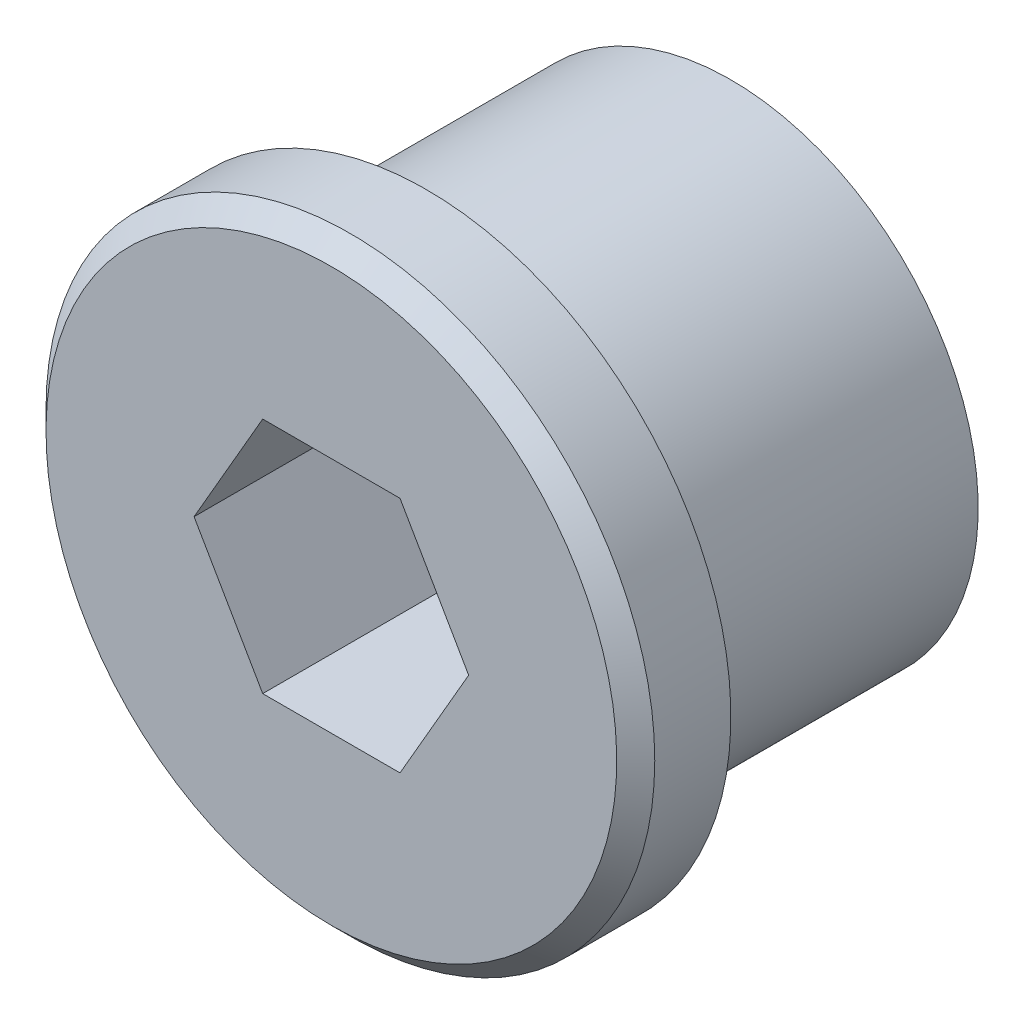
ISO-10303-21;
HEADER;
FILE_DESCRIPTION(('STEP AP214'),'2;1');
FILE_NAME('part.step','',(''),(''),'','','');
FILE_SCHEMA(('AUTOMOTIVE_DESIGN { 1 0 10303 214 1 1 1 1 }'));
ENDSEC;
DATA;
#1=APPLICATION_CONTEXT('core data for automotive mechanical design processes');
#2=APPLICATION_PROTOCOL_DEFINITION('international standard','automotive_design',2000,#1);
#3=PRODUCT_CONTEXT('',#1,'mechanical');
#4=PRODUCT('Part','Part','',(#3));
#5=PRODUCT_RELATED_PRODUCT_CATEGORY('part','',(#4));
#6=PRODUCT_DEFINITION_FORMATION('','',#4);
#7=PRODUCT_DEFINITION_CONTEXT('part definition',#1,'design');
#8=PRODUCT_DEFINITION('design','',#6,#7);
#9=PRODUCT_DEFINITION_SHAPE('','',#8);
#10=(LENGTH_UNIT() NAMED_UNIT(*) SI_UNIT(.MILLI.,.METRE.));
#11=(NAMED_UNIT(*) PLANE_ANGLE_UNIT() SI_UNIT($,.RADIAN.));
#12=(NAMED_UNIT(*) SI_UNIT($,.STERADIAN.) SOLID_ANGLE_UNIT());
#13=UNCERTAINTY_MEASURE_WITH_UNIT(LENGTH_MEASURE(1.E-05),#10,'distance_accuracy_value','');
#14=(GEOMETRIC_REPRESENTATION_CONTEXT(3) GLOBAL_UNCERTAINTY_ASSIGNED_CONTEXT((#13)) GLOBAL_UNIT_ASSIGNED_CONTEXT((#10,
#11,#12)) REPRESENTATION_CONTEXT('',''));
#15=CARTESIAN_POINT('',(0.,0.,0.));
#16=DIRECTION('',(0.,0.,1.));
#17=DIRECTION('',(1.,0.,0.));
#18=AXIS2_PLACEMENT_3D('',#15,#16,#17);
#19=CARTESIAN_POINT('',(0.,0.,-9.6));
#20=DIRECTION('',(0.,0.,1.));
#21=DIRECTION('',(1.,0.,0.));
#22=AXIS2_PLACEMENT_3D('',#19,#20,#21);
#23=PLANE('',#22);
#24=DIRECTION('',(0.500000000006738,0.866025403780548,0.));
#25=VECTOR('',#24,1.);
#26=CARTESIAN_POINT('',(2.886751346,-5.,-9.6));
#27=LINE('',#26,#25);
#28=CARTESIAN_POINT('',(2.886751346,-5.,-9.6));
#29=VERTEX_POINT('',#28);
#30=CARTESIAN_POINT('',(5.773502692,0.,-9.6));
#31=VERTEX_POINT('',#30);
#32=EDGE_CURVE('E179',#29,#31,#27,.T.);
#33=ORIENTED_EDGE('',*,*,#32,.T.);
#34=DIRECTION('',(-0.500000000006738,0.866025403780548,0.));
#35=VECTOR('',#34,1.);
#36=CARTESIAN_POINT('',(5.773502692,0.,-9.6));
#37=LINE('',#36,#35);
#38=CARTESIAN_POINT('',(2.886751346,5.,-9.6));
#39=VERTEX_POINT('',#38);
#40=EDGE_CURVE('E11',#31,#39,#37,.T.);
#41=ORIENTED_EDGE('',*,*,#40,.T.);
#42=DIRECTION('',(-1.,0.,0.));
#43=VECTOR('',#42,1.);
#44=CARTESIAN_POINT('',(2.886751346,5.,-9.6));
#45=LINE('',#44,#43);
#46=CARTESIAN_POINT('',(-2.886751346,5.,-9.6));
#47=VERTEX_POINT('',#46);
#48=EDGE_CURVE('E43',#39,#47,#45,.T.);
#49=ORIENTED_EDGE('',*,*,#48,.T.);
#50=DIRECTION('',(-0.500000000006738,-0.866025403780548,0.));
#51=VECTOR('',#50,1.);
#52=CARTESIAN_POINT('',(-2.886751346,5.,-9.6));
#53=LINE('',#52,#51);
#54=CARTESIAN_POINT('',(-5.773502692,0.,-9.6));
#55=VERTEX_POINT('',#54);
#56=EDGE_CURVE('E197',#47,#55,#53,.T.);
#57=ORIENTED_EDGE('',*,*,#56,.T.);
#58=DIRECTION('',(0.500000000006738,-0.866025403780548,0.));
#59=VECTOR('',#58,1.);
#60=CARTESIAN_POINT('',(-5.773502692,0.,-9.6));
#61=LINE('',#60,#59);
#62=CARTESIAN_POINT('',(-2.886751346,-5.,-9.6));
#63=VERTEX_POINT('',#62);
#64=EDGE_CURVE('E191',#55,#63,#61,.T.);
#65=ORIENTED_EDGE('',*,*,#64,.T.);
#66=DIRECTION('',(1.,0.,0.));
#67=VECTOR('',#66,1.);
#68=CARTESIAN_POINT('',(-2.886751346,-5.,-9.6));
#69=LINE('',#68,#67);
#70=EDGE_CURVE('E185',#63,#29,#69,.T.);
#71=ORIENTED_EDGE('',*,*,#70,.T.);
#72=EDGE_LOOP('',(#33,#41,#49,#57,#65,#71));
#73=FACE_BOUND('',#72,.T.);
#74=ADVANCED_FACE('F17',(#73),#23,.T.);
#75=CARTESIAN_POINT('',(5.773502692,0.,-9.6));
#76=DIRECTION('',(0.866025403838329,0.499999999906659,0.));
#77=DIRECTION('',(0.,0.,-1.));
#78=AXIS2_PLACEMENT_3D('',#75,#76,#77);
#79=PLANE('',#78);
#80=DIRECTION('',(-0.500000000006738,0.866025403780548,0.));
#81=VECTOR('',#80,1.);
#82=CARTESIAN_POINT('',(5.773502692,0.,0.));
#83=LINE('',#82,#81);
#84=CARTESIAN_POINT('',(5.773502692,0.,0.));
#85=VERTEX_POINT('',#84);
#86=CARTESIAN_POINT('',(2.886751346,5.,0.));
#87=VERTEX_POINT('',#86);
#88=EDGE_CURVE('E143',#85,#87,#83,.T.);
#89=ORIENTED_EDGE('',*,*,#88,.T.);
#90=DIRECTION('',(0.,0.,1.));
#91=VECTOR('',#90,1.);
#92=CARTESIAN_POINT('',(2.886751346,5.,-9.6));
#93=LINE('',#92,#91);
#94=EDGE_CURVE('E26',#39,#87,#93,.T.);
#95=ORIENTED_EDGE('',*,*,#94,.F.);
#96=ORIENTED_EDGE('',*,*,#40,.F.);
#97=DIRECTION('',(0.,0.,1.));
#98=VECTOR('',#97,1.);
#99=CARTESIAN_POINT('',(5.773502692,0.,-9.6));
#100=LINE('',#99,#98);
#101=EDGE_CURVE('E147',#31,#85,#100,.T.);
#102=ORIENTED_EDGE('',*,*,#101,.T.);
#103=EDGE_LOOP('',(#89,#95,#96,#102));
#104=FACE_BOUND('',#103,.T.);
#105=ADVANCED_FACE('F19',(#104),#79,.F.);
#106=CARTESIAN_POINT('',(2.886751346,5.,-9.6));
#107=DIRECTION('',(0.,1.,0.));
#108=DIRECTION('',(1.,0.,0.));
#109=AXIS2_PLACEMENT_3D('',#106,#107,#108);
#110=PLANE('',#109);
#111=DIRECTION('',(-1.,0.,0.));
#112=VECTOR('',#111,1.);
#113=CARTESIAN_POINT('',(2.886751346,5.,0.));
#114=LINE('',#113,#112);
#115=CARTESIAN_POINT('',(-2.886751346,5.,0.));
#116=VERTEX_POINT('',#115);
#117=EDGE_CURVE('E148',#87,#116,#114,.T.);
#118=ORIENTED_EDGE('',*,*,#117,.T.);
#119=DIRECTION('',(0.,0.,1.));
#120=VECTOR('',#119,1.);
#121=CARTESIAN_POINT('',(-2.886751346,5.,-9.6));
#122=LINE('',#121,#120);
#123=EDGE_CURVE('E128',#47,#116,#122,.T.);
#124=ORIENTED_EDGE('',*,*,#123,.F.);
#125=ORIENTED_EDGE('',*,*,#48,.F.);
#126=ORIENTED_EDGE('',*,*,#94,.T.);
#127=EDGE_LOOP('',(#118,#124,#125,#126));
#128=FACE_BOUND('',#127,.T.);
#129=ADVANCED_FACE('F204',(#128),#110,.F.);
#130=CARTESIAN_POINT('',(-2.886751346,5.,-9.6));
#131=DIRECTION('',(-0.866025403838329,0.499999999906659,0.));
#132=DIRECTION('',(0.,0.,1.));
#133=AXIS2_PLACEMENT_3D('',#130,#131,#132);
#134=PLANE('',#133);
#135=DIRECTION('',(-0.500000000006738,-0.866025403780548,0.));
#136=VECTOR('',#135,1.);
#137=CARTESIAN_POINT('',(-2.886751346,5.,0.));
#138=LINE('',#137,#136);
#139=CARTESIAN_POINT('',(-5.773502692,0.,0.));
#140=VERTEX_POINT('',#139);
#141=EDGE_CURVE('E167',#116,#140,#138,.T.);
#142=ORIENTED_EDGE('',*,*,#141,.T.);
#143=DIRECTION('',(0.,0.,1.));
#144=VECTOR('',#143,1.);
#145=CARTESIAN_POINT('',(-5.773502692,0.,-9.6));
#146=LINE('',#145,#144);
#147=EDGE_CURVE('E194',#55,#140,#146,.T.);
#148=ORIENTED_EDGE('',*,*,#147,.F.);
#149=ORIENTED_EDGE('',*,*,#56,.F.);
#150=ORIENTED_EDGE('',*,*,#123,.T.);
#151=EDGE_LOOP('',(#142,#148,#149,#150));
#152=FACE_BOUND('',#151,.T.);
#153=ADVANCED_FACE('F216',(#152),#134,.F.);
#154=CARTESIAN_POINT('',(-5.773502692,0.,-9.6));
#155=DIRECTION('',(-0.866025403838329,-0.499999999906659,0.));
#156=DIRECTION('',(-0.499999999906659,0.866025403838329,0.));
#157=AXIS2_PLACEMENT_3D('',#154,#155,#156);
#158=PLANE('',#157);
#159=DIRECTION('',(0.500000000006738,-0.866025403780548,0.));
#160=VECTOR('',#159,1.);
#161=CARTESIAN_POINT('',(-5.773502692,0.,0.));
#162=LINE('',#161,#160);
#163=CARTESIAN_POINT('',(-2.886751346,-5.,0.));
#164=VERTEX_POINT('',#163);
#165=EDGE_CURVE('E166',#140,#164,#162,.T.);
#166=ORIENTED_EDGE('',*,*,#165,.T.);
#167=DIRECTION('',(0.,0.,1.));
#168=VECTOR('',#167,1.);
#169=CARTESIAN_POINT('',(-2.886751346,-5.,-9.6));
#170=LINE('',#169,#168);
#171=EDGE_CURVE('E188',#63,#164,#170,.T.);
#172=ORIENTED_EDGE('',*,*,#171,.F.);
#173=ORIENTED_EDGE('',*,*,#64,.F.);
#174=ORIENTED_EDGE('',*,*,#147,.T.);
#175=EDGE_LOOP('',(#166,#172,#173,#174));
#176=FACE_BOUND('',#175,.T.);
#177=ADVANCED_FACE('F226',(#176),#158,.F.);
#178=CARTESIAN_POINT('',(-2.886751346,-5.,-9.6));
#179=DIRECTION('',(0.,-1.,0.));
#180=DIRECTION('',(0.,0.,-1.));
#181=AXIS2_PLACEMENT_3D('',#178,#179,#180);
#182=PLANE('',#181);
#183=DIRECTION('',(1.,0.,0.));
#184=VECTOR('',#183,1.);
#185=CARTESIAN_POINT('',(-2.886751346,-5.,0.));
#186=LINE('',#185,#184);
#187=CARTESIAN_POINT('',(2.886751346,-5.,0.));
#188=VERTEX_POINT('',#187);
#189=EDGE_CURVE('E162',#164,#188,#186,.T.);
#190=ORIENTED_EDGE('',*,*,#189,.T.);
#191=DIRECTION('',(0.,0.,1.));
#192=VECTOR('',#191,1.);
#193=CARTESIAN_POINT('',(2.886751346,-5.,-9.6));
#194=LINE('',#193,#192);
#195=EDGE_CURVE('E182',#29,#188,#194,.T.);
#196=ORIENTED_EDGE('',*,*,#195,.F.);
#197=ORIENTED_EDGE('',*,*,#70,.F.);
#198=ORIENTED_EDGE('',*,*,#171,.T.);
#199=EDGE_LOOP('',(#190,#196,#197,#198));
#200=FACE_BOUND('',#199,.T.);
#201=ADVANCED_FACE('F228',(#200),#182,.F.);
#202=CARTESIAN_POINT('',(2.886751346,-5.,-9.6));
#203=DIRECTION('',(0.866025403838329,-0.499999999906659,0.));
#204=DIRECTION('',(0.,0.,-1.));
#205=AXIS2_PLACEMENT_3D('',#202,#203,#204);
#206=PLANE('',#205);
#207=DIRECTION('',(0.500000000006738,0.866025403780548,0.));
#208=VECTOR('',#207,1.);
#209=CARTESIAN_POINT('',(2.886751346,-5.,0.));
#210=LINE('',#209,#208);
#211=EDGE_CURVE('E158',#188,#85,#210,.T.);
#212=ORIENTED_EDGE('',*,*,#211,.T.);
#213=ORIENTED_EDGE('',*,*,#101,.F.);
#214=ORIENTED_EDGE('',*,*,#32,.F.);
#215=ORIENTED_EDGE('',*,*,#195,.T.);
#216=EDGE_LOOP('',(#212,#213,#214,#215));
#217=FACE_BOUND('',#216,.T.);
#218=ADVANCED_FACE('F231',(#217),#206,.F.);
#219=CARTESIAN_POINT('',(0.,0.,-16.8));
#220=DIRECTION('',(0.,0.,1.));
#221=DIRECTION('',(1.,0.,0.));
#222=AXIS2_PLACEMENT_3D('',#219,#220,#221);
#223=PLANE('',#222);
#224=CARTESIAN_POINT('',(0.,0.,-16.8));
#225=DIRECTION('',(0.,0.,1.));
#226=DIRECTION('',(1.,0.,0.));
#227=AXIS2_PLACEMENT_3D('',#224,#225,#226);
#228=CIRCLE('',#227,10.4);
#229=CARTESIAN_POINT('',(-10.4,0.,-16.8));
#230=VERTEX_POINT('',#229);
#231=EDGE_CURVE('E142',#230,#230,#228,.T.);
#232=ORIENTED_EDGE('',*,*,#231,.F.);
#233=EDGE_LOOP('',(#232));
#234=FACE_BOUND('',#233,.T.);
#235=ADVANCED_FACE('F233',(#234),#223,.F.);
#236=CARTESIAN_POINT('',(0.,0.,-4.));
#237=DIRECTION('',(0.,0.,1.));
#238=DIRECTION('',(1.,0.,0.));
#239=AXIS2_PLACEMENT_3D('',#236,#237,#238);
#240=PLANE('',#239);
#241=CARTESIAN_POINT('',(0.,0.,-4.));
#242=DIRECTION('',(0.,0.,1.));
#243=DIRECTION('',(1.,0.,0.));
#244=AXIS2_PLACEMENT_3D('',#241,#242,#243);
#245=CIRCLE('',#244,10.4);
#246=CARTESIAN_POINT('',(-10.4,0.,-4.));
#247=VERTEX_POINT('',#246);
#248=EDGE_CURVE('E132',#247,#247,#245,.T.);
#249=ORIENTED_EDGE('',*,*,#248,.T.);
#250=EDGE_LOOP('',(#249));
#251=FACE_BOUND('',#250,.T.);
#252=CARTESIAN_POINT('',(0.,0.,-4.));
#253=DIRECTION('',(0.,0.,-1.));
#254=DIRECTION('',(-1.,0.,0.));
#255=AXIS2_PLACEMENT_3D('',#252,#253,#254);
#256=CIRCLE('',#255,12.8);
#257=CARTESIAN_POINT('',(-12.8,0.,-4.00000000000009));
#258=VERTEX_POINT('',#257);
#259=EDGE_CURVE('E155',#258,#258,#256,.T.);
#260=ORIENTED_EDGE('',*,*,#259,.T.);
#261=EDGE_LOOP('',(#260));
#262=FACE_BOUND('',#261,.T.);
#263=ADVANCED_FACE('F240',(#251,#262),#240,.F.);
#264=CARTESIAN_POINT('',(0.,0.,0.));
#265=DIRECTION('',(0.,0.,1.));
#266=DIRECTION('',(1.,0.,0.));
#267=AXIS2_PLACEMENT_3D('',#264,#265,#266);
#268=PLANE('',#267);
#269=ORIENTED_EDGE('',*,*,#211,.F.);
#270=ORIENTED_EDGE('',*,*,#189,.F.);
#271=ORIENTED_EDGE('',*,*,#165,.F.);
#272=ORIENTED_EDGE('',*,*,#141,.F.);
#273=ORIENTED_EDGE('',*,*,#117,.F.);
#274=ORIENTED_EDGE('',*,*,#88,.F.);
#275=EDGE_LOOP('',(#269,#270,#271,#272,#273,#274));
#276=FACE_BOUND('',#275,.T.);
#277=CARTESIAN_POINT('',(0.,0.,0.));
#278=DIRECTION('',(0.,0.,1.));
#279=DIRECTION('',(1.,0.,0.));
#280=AXIS2_PLACEMENT_3D('',#277,#278,#279);
#281=CIRCLE('',#280,12.);
#282=CARTESIAN_POINT('',(9.70820393249936,-7.05342302750969,0.));
#283=VERTEX_POINT('',#282);
#284=EDGE_CURVE('E113',#283,#283,#281,.T.);
#285=ORIENTED_EDGE('',*,*,#284,.T.);
#286=EDGE_LOOP('',(#285));
#287=FACE_BOUND('',#286,.T.);
#288=ADVANCED_FACE('F122',(#276,#287),#268,.T.);
#289=CARTESIAN_POINT('',(0.,0.,-2.4));
#290=DIRECTION('',(0.,0.,1.));
#291=DIRECTION('',(1.,0.,0.));
#292=AXIS2_PLACEMENT_3D('',#289,#290,#291);
#293=CYLINDRICAL_SURFACE('',#292,12.8);
#294=CARTESIAN_POINT('',(0.,0.,-0.79999999999996));
#295=DIRECTION('',(0.,0.,-1.));
#296=DIRECTION('',(-1.,0.,0.));
#297=AXIS2_PLACEMENT_3D('',#294,#295,#296);
#298=CIRCLE('',#297,12.8);
#299=CARTESIAN_POINT('',(-12.8,0.,-0.8));
#300=VERTEX_POINT('',#299);
#301=CARTESIAN_POINT('',(10.3554175279994,-7.5236512293437,-0.800000000000042));
#302=VERTEX_POINT('',#301);
#303=EDGE_CURVE('E119',#300,#302,#298,.T.);
#304=ORIENTED_EDGE('',*,*,#303,.T.);
#305=CARTESIAN_POINT('',(0.,0.,-0.79999999999996));
#306=DIRECTION('',(0.,0.,-1.));
#307=DIRECTION('',(-1.,0.,0.));
#308=AXIS2_PLACEMENT_3D('',#305,#306,#307);
#309=CIRCLE('',#308,12.8);
#310=EDGE_CURVE('E116',#302,#300,#309,.T.);
#311=ORIENTED_EDGE('',*,*,#310,.T.);
#312=DIRECTION('',(0.,0.,-1.));
#313=VECTOR('',#312,1.);
#314=CARTESIAN_POINT('',(-12.8,0.,-2.4));
#315=LINE('',#314,#313);
#316=EDGE_CURVE('E151',#300,#258,#315,.T.);
#317=ORIENTED_EDGE('',*,*,#316,.T.);
#318=ORIENTED_EDGE('',*,*,#259,.F.);
#319=ORIENTED_EDGE('',*,*,#316,.F.);
#320=EDGE_LOOP('',(#304,#311,#317,#318,#319));
#321=FACE_BOUND('',#320,.T.);
#322=ADVANCED_FACE('F262',(#321),#293,.T.);
#323=CARTESIAN_POINT('',(0.,0.,-10.4));
#324=DIRECTION('',(0.,0.,1.));
#325=DIRECTION('',(1.,0.,0.));
#326=AXIS2_PLACEMENT_3D('',#323,#324,#325);
#327=CYLINDRICAL_SURFACE('',#326,10.4);
#328=ORIENTED_EDGE('',*,*,#248,.F.);
#329=DIRECTION('',(0.,0.,-1.));
#330=VECTOR('',#329,1.);
#331=CARTESIAN_POINT('',(-10.4,0.,-10.4));
#332=LINE('',#331,#330);
#333=EDGE_CURVE('E138',#247,#230,#332,.T.);
#334=ORIENTED_EDGE('',*,*,#333,.T.);
#335=ORIENTED_EDGE('',*,*,#231,.T.);
#336=ORIENTED_EDGE('',*,*,#333,.F.);
#337=EDGE_LOOP('',(#328,#334,#335,#336));
#338=FACE_BOUND('',#337,.T.);
#339=ADVANCED_FACE('F274',(#338),#327,.T.);
#340=CARTESIAN_POINT('',(0.,0.,-0.720000000000029));
#341=DIRECTION('',(0.,0.,-1.));
#342=DIRECTION('',(-0.809016994374947,0.587785252292474,0.));
#343=AXIS2_PLACEMENT_3D('',#340,#341,#342);
#344=CONICAL_SURFACE('',#343,12.72,0.785398163397449);
#345=ORIENTED_EDGE('',*,*,#284,.F.);
#346=DIRECTION('',(0.572061402817684,-0.415626937777454,-0.707106781186547));
#347=VECTOR('',#346,1.);
#348=CARTESIAN_POINT('',(10.2906961684493,-7.47662840916029,-0.72000000000003));
#349=LINE('',#348,#347);
#350=EDGE_CURVE('E110',#283,#302,#349,.T.);
#351=ORIENTED_EDGE('',*,*,#350,.T.);
#352=ORIENTED_EDGE('',*,*,#303,.F.);
#353=ORIENTED_EDGE('',*,*,#310,.F.);
#354=ORIENTED_EDGE('',*,*,#350,.F.);
#355=EDGE_LOOP('',(#345,#351,#352,#353,#354));
#356=FACE_BOUND('',#355,.T.);
#357=ADVANCED_FACE('F112',(#356),#344,.T.);
#358=CLOSED_SHELL('',(#74,#105,#129,#153,#177,#201,#218,#235,#263,#288,#322,#339,#357));
#359=MANIFOLD_SOLID_BREP('B1',#358);
#360=ADVANCED_BREP_SHAPE_REPRESENTATION('',(#18,#359),#14);
#361=SHAPE_DEFINITION_REPRESENTATION(#9,#360);
ENDSEC;
END-ISO-10303-21;
